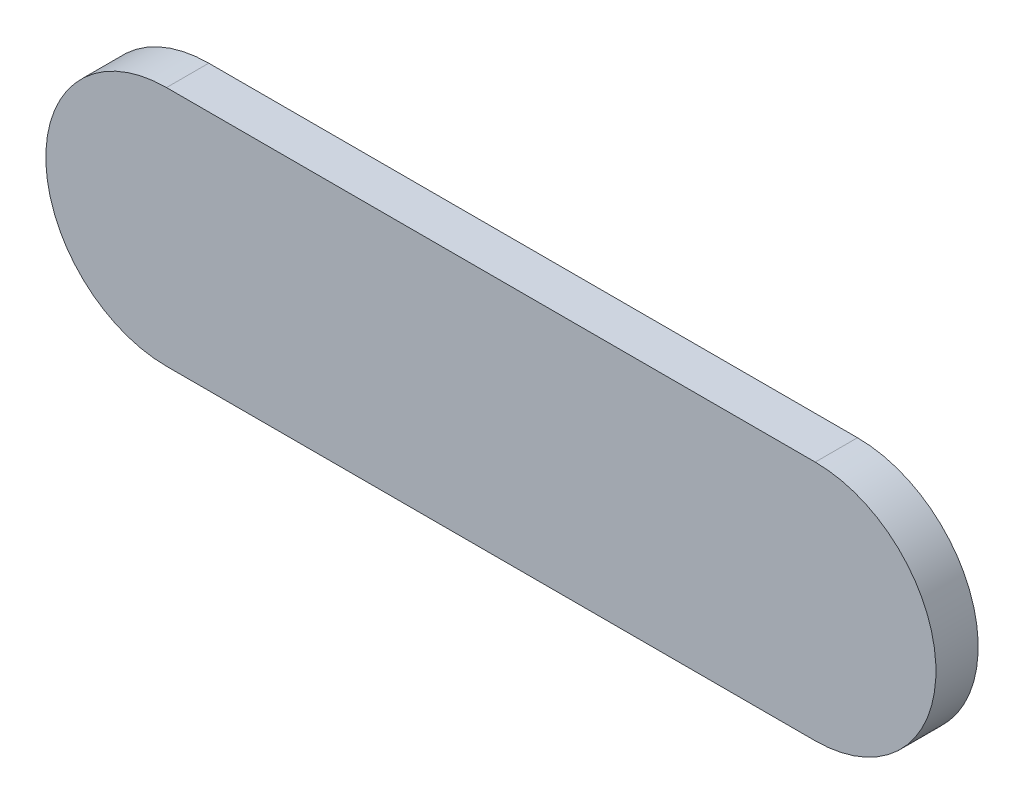
ISO-10303-21;
HEADER;
FILE_DESCRIPTION(('STEP AP214'),'2;1');
FILE_NAME('part.step','',(''),(''),'','','');
FILE_SCHEMA(('AUTOMOTIVE_DESIGN { 1 0 10303 214 1 1 1 1 }'));
ENDSEC;
DATA;
#1=APPLICATION_CONTEXT('core data for automotive mechanical design processes');
#2=APPLICATION_PROTOCOL_DEFINITION('international standard','automotive_design',2000,#1);
#3=PRODUCT_CONTEXT('',#1,'mechanical');
#4=PRODUCT('Part','Part','',(#3));
#5=PRODUCT_RELATED_PRODUCT_CATEGORY('part','',(#4));
#6=PRODUCT_DEFINITION_FORMATION('','',#4);
#7=PRODUCT_DEFINITION_CONTEXT('part definition',#1,'design');
#8=PRODUCT_DEFINITION('design','',#6,#7);
#9=PRODUCT_DEFINITION_SHAPE('','',#8);
#10=(LENGTH_UNIT() NAMED_UNIT(*) SI_UNIT(.MILLI.,.METRE.));
#11=(NAMED_UNIT(*) PLANE_ANGLE_UNIT() SI_UNIT($,.RADIAN.));
#12=(NAMED_UNIT(*) SI_UNIT($,.STERADIAN.) SOLID_ANGLE_UNIT());
#13=UNCERTAINTY_MEASURE_WITH_UNIT(LENGTH_MEASURE(1.E-05),#10,'distance_accuracy_value','');
#14=(GEOMETRIC_REPRESENTATION_CONTEXT(3) GLOBAL_UNCERTAINTY_ASSIGNED_CONTEXT((#13)) GLOBAL_UNIT_ASSIGNED_CONTEXT((#10,
#11,#12)) REPRESENTATION_CONTEXT('',''));
#15=CARTESIAN_POINT('',(0.,0.,0.));
#16=DIRECTION('',(0.,0.,1.));
#17=DIRECTION('',(1.,0.,0.));
#18=AXIS2_PLACEMENT_3D('',#15,#16,#17);
#19=CARTESIAN_POINT('',(85.3875,-112.5,1.635));
#20=DIRECTION('',(0.,0.,1.));
#21=DIRECTION('',(1.,0.,0.));
#22=AXIS2_PLACEMENT_3D('',#19,#20,#21);
#23=PLANE('',#22);
#24=DIRECTION('',(1.,0.,0.));
#25=VECTOR('',#24,1.);
#26=CARTESIAN_POINT('',(85.3875,-112.5,1.635));
#27=LINE('',#26,#25);
#28=CARTESIAN_POINT('',(85.3875,-112.5,1.635));
#29=VERTEX_POINT('',#28);
#30=CARTESIAN_POINT('',(85.925,-112.5,1.635));
#31=VERTEX_POINT('',#30);
#32=EDGE_CURVE('E97',#29,#31,#27,.T.);
#33=ORIENTED_EDGE('',*,*,#32,.T.);
#34=CARTESIAN_POINT('',(85.925,-112.4,1.635));
#35=DIRECTION('',(0.,0.,1.));
#36=DIRECTION('',(0.,-1.,0.));
#37=AXIS2_PLACEMENT_3D('',#34,#35,#36);
#38=CIRCLE('',#37,0.1);
#39=CARTESIAN_POINT('',(85.925,-112.3,1.635));
#40=VERTEX_POINT('',#39);
#41=EDGE_CURVE('E77',#31,#40,#38,.T.);
#42=ORIENTED_EDGE('',*,*,#41,.T.);
#43=DIRECTION('',(-1.,0.,0.));
#44=VECTOR('',#43,1.);
#45=CARTESIAN_POINT('',(85.925,-112.3,1.635));
#46=LINE('',#45,#44);
#47=CARTESIAN_POINT('',(85.3875,-112.3,1.635));
#48=VERTEX_POINT('',#47);
#49=EDGE_CURVE('E81',#40,#48,#46,.T.);
#50=ORIENTED_EDGE('',*,*,#49,.T.);
#51=CARTESIAN_POINT('',(85.3875,-112.4,1.635));
#52=DIRECTION('',(0.,0.,1.));
#53=DIRECTION('',(0.,1.,0.));
#54=AXIS2_PLACEMENT_3D('',#51,#52,#53);
#55=CIRCLE('',#54,0.1);
#56=EDGE_CURVE('E11',#48,#29,#55,.T.);
#57=ORIENTED_EDGE('',*,*,#56,.T.);
#58=EDGE_LOOP('',(#33,#42,#50,#57));
#59=FACE_BOUND('',#58,.T.);
#60=ADVANCED_FACE('F17',(#59),#23,.T.);
#61=CARTESIAN_POINT('',(85.3875,-112.5,1.6));
#62=DIRECTION('',(0.,0.,1.));
#63=DIRECTION('',(1.,0.,0.));
#64=AXIS2_PLACEMENT_3D('',#61,#62,#63);
#65=PLANE('',#64);
#66=CARTESIAN_POINT('',(85.3875,-112.4,1.6));
#67=DIRECTION('',(0.,0.,1.));
#68=DIRECTION('',(0.,1.,0.));
#69=AXIS2_PLACEMENT_3D('',#66,#67,#68);
#70=CIRCLE('',#69,0.1);
#71=CARTESIAN_POINT('',(85.3875,-112.3,1.6));
#72=VERTEX_POINT('',#71);
#73=CARTESIAN_POINT('',(85.3875,-112.5,1.6));
#74=VERTEX_POINT('',#73);
#75=EDGE_CURVE('E25',#72,#74,#70,.T.);
#76=ORIENTED_EDGE('',*,*,#75,.F.);
#77=DIRECTION('',(-1.,0.,0.));
#78=VECTOR('',#77,1.);
#79=CARTESIAN_POINT('',(85.925,-112.3,1.6));
#80=LINE('',#79,#78);
#81=CARTESIAN_POINT('',(85.925,-112.3,1.6));
#82=VERTEX_POINT('',#81);
#83=EDGE_CURVE('E67',#82,#72,#80,.T.);
#84=ORIENTED_EDGE('',*,*,#83,.F.);
#85=CARTESIAN_POINT('',(85.925,-112.4,1.6));
#86=DIRECTION('',(0.,0.,1.));
#87=DIRECTION('',(0.,-1.,0.));
#88=AXIS2_PLACEMENT_3D('',#85,#86,#87);
#89=CIRCLE('',#88,0.1);
#90=CARTESIAN_POINT('',(85.925,-112.5,1.6));
#91=VERTEX_POINT('',#90);
#92=EDGE_CURVE('E71',#91,#82,#89,.T.);
#93=ORIENTED_EDGE('',*,*,#92,.F.);
#94=DIRECTION('',(1.,0.,0.));
#95=VECTOR('',#94,1.);
#96=CARTESIAN_POINT('',(85.3875,-112.5,1.6));
#97=LINE('',#96,#95);
#98=EDGE_CURVE('E115',#74,#91,#97,.T.);
#99=ORIENTED_EDGE('',*,*,#98,.F.);
#100=EDGE_LOOP('',(#76,#84,#93,#99));
#101=FACE_BOUND('',#100,.T.);
#102=ADVANCED_FACE('F69',(#101),#65,.F.);
#103=CARTESIAN_POINT('',(85.3875,-112.4,1.6));
#104=DIRECTION('',(0.,0.,-1.));
#105=DIRECTION('',(0.,1.,0.));
#106=AXIS2_PLACEMENT_3D('',#103,#104,#105);
#107=CYLINDRICAL_SURFACE('',#106,0.1);
#108=ORIENTED_EDGE('',*,*,#75,.T.);
#109=DIRECTION('',(0.,0.,1.));
#110=VECTOR('',#109,1.);
#111=CARTESIAN_POINT('',(85.3875,-112.5,1.6));
#112=LINE('',#111,#110);
#113=EDGE_CURVE('E91',#74,#29,#112,.T.);
#114=ORIENTED_EDGE('',*,*,#113,.T.);
#115=ORIENTED_EDGE('',*,*,#56,.F.);
#116=DIRECTION('',(0.,0.,1.));
#117=VECTOR('',#116,1.);
#118=CARTESIAN_POINT('',(85.3875,-112.3,1.6));
#119=LINE('',#118,#117);
#120=EDGE_CURVE('E76',#72,#48,#119,.T.);
#121=ORIENTED_EDGE('',*,*,#120,.F.);
#122=EDGE_LOOP('',(#108,#114,#115,#121));
#123=FACE_BOUND('',#122,.T.);
#124=ADVANCED_FACE('F126',(#123),#107,.T.);
#125=CARTESIAN_POINT('',(85.925,-112.3,1.6));
#126=DIRECTION('',(0.,-1.,0.));
#127=DIRECTION('',(0.,0.,-1.));
#128=AXIS2_PLACEMENT_3D('',#125,#126,#127);
#129=PLANE('',#128);
#130=ORIENTED_EDGE('',*,*,#83,.T.);
#131=ORIENTED_EDGE('',*,*,#120,.T.);
#132=ORIENTED_EDGE('',*,*,#49,.F.);
#133=DIRECTION('',(0.,0.,1.));
#134=VECTOR('',#133,1.);
#135=CARTESIAN_POINT('',(85.925,-112.3,1.6));
#136=LINE('',#135,#134);
#137=EDGE_CURVE('E79',#82,#40,#136,.T.);
#138=ORIENTED_EDGE('',*,*,#137,.F.);
#139=EDGE_LOOP('',(#130,#131,#132,#138));
#140=FACE_BOUND('',#139,.T.);
#141=ADVANCED_FACE('F80',(#140),#129,.F.);
#142=CARTESIAN_POINT('',(85.925,-112.4,1.6));
#143=DIRECTION('',(0.,0.,-1.));
#144=DIRECTION('',(0.,-1.,0.));
#145=AXIS2_PLACEMENT_3D('',#142,#143,#144);
#146=CYLINDRICAL_SURFACE('',#145,0.1);
#147=ORIENTED_EDGE('',*,*,#92,.T.);
#148=ORIENTED_EDGE('',*,*,#137,.T.);
#149=ORIENTED_EDGE('',*,*,#41,.F.);
#150=DIRECTION('',(0.,0.,1.));
#151=VECTOR('',#150,1.);
#152=CARTESIAN_POINT('',(85.925,-112.5,1.6));
#153=LINE('',#152,#151);
#154=EDGE_CURVE('E88',#91,#31,#153,.T.);
#155=ORIENTED_EDGE('',*,*,#154,.F.);
#156=EDGE_LOOP('',(#147,#148,#149,#155));
#157=FACE_BOUND('',#156,.T.);
#158=ADVANCED_FACE('F86',(#157),#146,.T.);
#159=CARTESIAN_POINT('',(85.3875,-112.5,1.6));
#160=DIRECTION('',(0.,1.,0.));
#161=DIRECTION('',(1.,0.,0.));
#162=AXIS2_PLACEMENT_3D('',#159,#160,#161);
#163=PLANE('',#162);
#164=ORIENTED_EDGE('',*,*,#98,.T.);
#165=ORIENTED_EDGE('',*,*,#154,.T.);
#166=ORIENTED_EDGE('',*,*,#32,.F.);
#167=ORIENTED_EDGE('',*,*,#113,.F.);
#168=EDGE_LOOP('',(#164,#165,#166,#167));
#169=FACE_BOUND('',#168,.T.);
#170=ADVANCED_FACE('F114',(#169),#163,.F.);
#171=CLOSED_SHELL('',(#60,#102,#124,#141,#158,#170));
#172=MANIFOLD_SOLID_BREP('B1',#171);
#173=ADVANCED_BREP_SHAPE_REPRESENTATION('',(#18,#172),#14);
#174=SHAPE_DEFINITION_REPRESENTATION(#9,#173);
ENDSEC;
END-ISO-10303-21;
